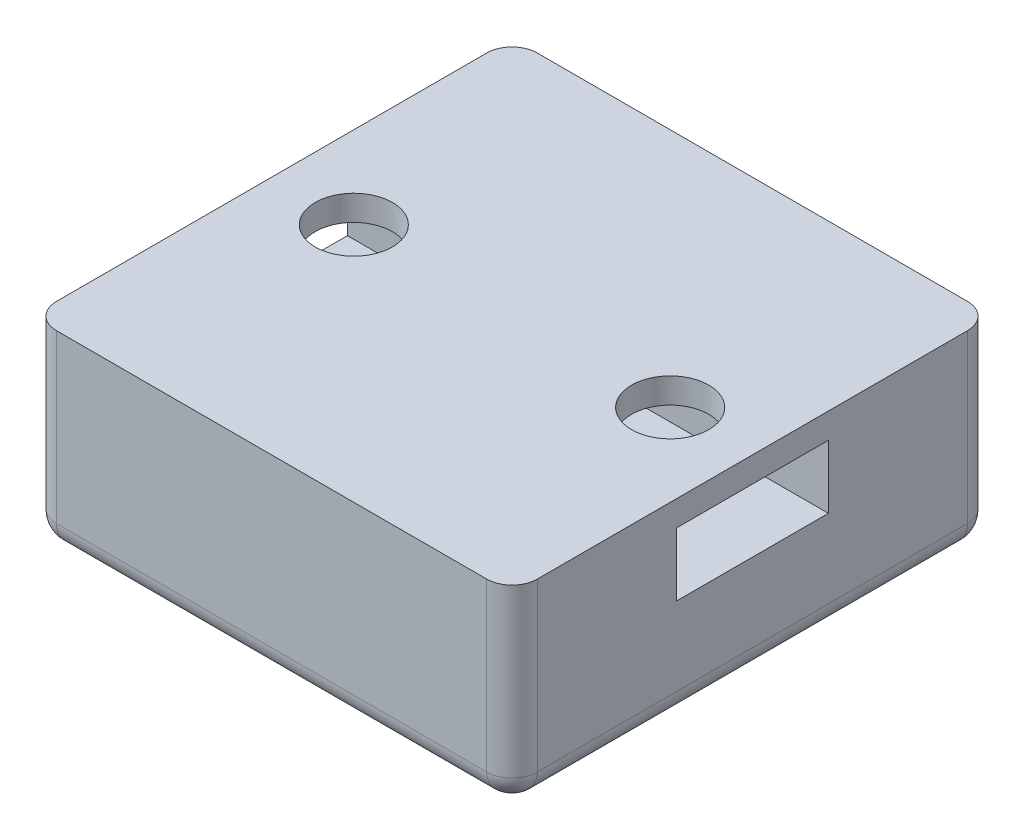
ISO-10303-21;
HEADER;
FILE_DESCRIPTION(('STEP AP214'),'2;1');
FILE_NAME('part.step','',(''),(''),'','','');
FILE_SCHEMA(('AUTOMOTIVE_DESIGN { 1 0 10303 214 1 1 1 1 }'));
ENDSEC;
DATA;
#1=APPLICATION_CONTEXT('core data for automotive mechanical design processes');
#2=APPLICATION_PROTOCOL_DEFINITION('international standard','automotive_design',2000,#1);
#3=PRODUCT_CONTEXT('',#1,'mechanical');
#4=PRODUCT('Part','Part','',(#3));
#5=PRODUCT_RELATED_PRODUCT_CATEGORY('part','',(#4));
#6=PRODUCT_DEFINITION_FORMATION('','',#4);
#7=PRODUCT_DEFINITION_CONTEXT('part definition',#1,'design');
#8=PRODUCT_DEFINITION('design','',#6,#7);
#9=PRODUCT_DEFINITION_SHAPE('','',#8);
#10=(LENGTH_UNIT() NAMED_UNIT(*) SI_UNIT(.MILLI.,.METRE.));
#11=(NAMED_UNIT(*) PLANE_ANGLE_UNIT() SI_UNIT($,.RADIAN.));
#12=(NAMED_UNIT(*) SI_UNIT($,.STERADIAN.) SOLID_ANGLE_UNIT());
#13=UNCERTAINTY_MEASURE_WITH_UNIT(LENGTH_MEASURE(1.E-05),#10,'distance_accuracy_value','');
#14=(GEOMETRIC_REPRESENTATION_CONTEXT(3) GLOBAL_UNCERTAINTY_ASSIGNED_CONTEXT((#13)) GLOBAL_UNIT_ASSIGNED_CONTEXT((#10,
#11,#12)) REPRESENTATION_CONTEXT('',''));
#15=CARTESIAN_POINT('',(0.,0.,0.));
#16=DIRECTION('',(0.,0.,1.));
#17=DIRECTION('',(1.,0.,0.));
#18=AXIS2_PLACEMENT_3D('',#15,#16,#17);
#19=CARTESIAN_POINT('',(0.,7.6,0.));
#20=DIRECTION('',(1.,0.,0.));
#21=DIRECTION('',(0.,0.,-1.));
#22=AXIS2_PLACEMENT_3D('',#19,#20,#21);
#23=PLANE('',#22);
#24=DIRECTION('',(0.,0.,-1.));
#25=VECTOR('',#24,1.);
#26=CARTESIAN_POINT('',(0.,6.6,-6.5));
#27=LINE('',#26,#25);
#28=CARTESIAN_POINT('',(0.,6.6,-6.5));
#29=VERTEX_POINT('',#28);
#30=CARTESIAN_POINT('',(0.,6.6,-12.5));
#31=VERTEX_POINT('',#30);
#32=EDGE_CURVE('E173',#29,#31,#27,.T.);
#33=ORIENTED_EDGE('',*,*,#32,.F.);
#34=DIRECTION('',(0.,1.,0.));
#35=VECTOR('',#34,1.);
#36=CARTESIAN_POINT('',(0.,6.6,-6.5));
#37=LINE('',#36,#35);
#38=CARTESIAN_POINT('',(0.,4.1,-6.5));
#39=VERTEX_POINT('',#38);
#40=EDGE_CURVE('E150',#39,#29,#37,.T.);
#41=ORIENTED_EDGE('',*,*,#40,.F.);
#42=DIRECTION('',(0.,0.,1.));
#43=VECTOR('',#42,1.);
#44=CARTESIAN_POINT('',(0.,4.1,-6.5));
#45=LINE('',#44,#43);
#46=CARTESIAN_POINT('',(0.,4.1,-12.5));
#47=VERTEX_POINT('',#46);
#48=EDGE_CURVE('E163',#47,#39,#45,.T.);
#49=ORIENTED_EDGE('',*,*,#48,.F.);
#50=DIRECTION('',(0.,-1.,0.));
#51=VECTOR('',#50,1.);
#52=CARTESIAN_POINT('',(0.,6.6,-12.5));
#53=LINE('',#52,#51);
#54=EDGE_CURVE('E180',#31,#47,#53,.T.);
#55=ORIENTED_EDGE('',*,*,#54,.F.);
#56=EDGE_LOOP('',(#33,#41,#49,#55));
#57=FACE_BOUND('',#56,.T.);
#58=DIRECTION('',(0.,-1.,0.));
#59=VECTOR('',#58,1.);
#60=CARTESIAN_POINT('',(0.,7.6,-18.));
#61=LINE('',#60,#59);
#62=CARTESIAN_POINT('',(0.,7.6,-18.));
#63=VERTEX_POINT('',#62);
#64=CARTESIAN_POINT('',(0.,1.,-18.));
#65=VERTEX_POINT('',#64);
#66=EDGE_CURVE('E218',#63,#65,#61,.T.);
#67=ORIENTED_EDGE('',*,*,#66,.T.);
#68=DIRECTION('',(0.,0.,1.));
#69=VECTOR('',#68,1.);
#70=CARTESIAN_POINT('',(0.,1.,-1.));
#71=LINE('',#70,#69);
#72=CARTESIAN_POINT('',(0.,1.,-1.));
#73=VERTEX_POINT('',#72);
#74=EDGE_CURVE('E50',#65,#73,#71,.T.);
#75=ORIENTED_EDGE('',*,*,#74,.T.);
#76=DIRECTION('',(0.,-1.,0.));
#77=VECTOR('',#76,1.);
#78=CARTESIAN_POINT('',(0.,7.6,-1.));
#79=LINE('',#78,#77);
#80=CARTESIAN_POINT('',(0.,7.6,-1.));
#81=VERTEX_POINT('',#80);
#82=EDGE_CURVE('E215',#73,#81,#79,.F.);
#83=ORIENTED_EDGE('',*,*,#82,.T.);
#84=DIRECTION('',(0.,0.,1.));
#85=VECTOR('',#84,1.);
#86=CARTESIAN_POINT('',(0.,7.6,0.));
#87=LINE('',#86,#85);
#88=EDGE_CURVE('E168',#63,#81,#87,.T.);
#89=ORIENTED_EDGE('',*,*,#88,.F.);
#90=EDGE_LOOP('',(#67,#75,#83,#89));
#91=FACE_BOUND('',#90,.T.);
#92=ADVANCED_FACE('F40',(#57,#91),#23,.F.);
#93=CARTESIAN_POINT('',(0.,7.6,0.));
#94=DIRECTION('',(0.,0.,-1.));
#95=DIRECTION('',(-1.,0.,0.));
#96=AXIS2_PLACEMENT_3D('',#93,#94,#95);
#97=PLANE('',#96);
#98=DIRECTION('',(0.,-1.,0.));
#99=VECTOR('',#98,1.);
#100=CARTESIAN_POINT('',(1.,7.6,0.));
#101=LINE('',#100,#99);
#102=CARTESIAN_POINT('',(1.,7.6,0.));
#103=VERTEX_POINT('',#102);
#104=CARTESIAN_POINT('',(1.,1.,0.));
#105=VERTEX_POINT('',#104);
#106=EDGE_CURVE('E249',#103,#105,#101,.T.);
#107=ORIENTED_EDGE('',*,*,#106,.T.);
#108=DIRECTION('',(1.,0.,0.));
#109=VECTOR('',#108,1.);
#110=CARTESIAN_POINT('',(18.,1.,0.));
#111=LINE('',#110,#109);
#112=CARTESIAN_POINT('',(18.,1.,0.));
#113=VERTEX_POINT('',#112);
#114=EDGE_CURVE('E257',#105,#113,#111,.T.);
#115=ORIENTED_EDGE('',*,*,#114,.T.);
#116=DIRECTION('',(0.,-1.,0.));
#117=VECTOR('',#116,1.);
#118=CARTESIAN_POINT('',(18.,7.6,0.));
#119=LINE('',#118,#117);
#120=CARTESIAN_POINT('',(18.,7.6,0.));
#121=VERTEX_POINT('',#120);
#122=EDGE_CURVE('E246',#113,#121,#119,.F.);
#123=ORIENTED_EDGE('',*,*,#122,.T.);
#124=DIRECTION('',(1.,0.,0.));
#125=VECTOR('',#124,1.);
#126=CARTESIAN_POINT('',(0.,7.6,0.));
#127=LINE('',#126,#125);
#128=EDGE_CURVE('E203',#103,#121,#127,.T.);
#129=ORIENTED_EDGE('',*,*,#128,.F.);
#130=EDGE_LOOP('',(#107,#115,#123,#129));
#131=FACE_BOUND('',#130,.T.);
#132=ADVANCED_FACE('F362',(#131),#97,.F.);
#133=CARTESIAN_POINT('',(19.,7.6,0.));
#134=DIRECTION('',(-1.,0.,0.));
#135=DIRECTION('',(0.,0.,1.));
#136=AXIS2_PLACEMENT_3D('',#133,#134,#135);
#137=PLANE('',#136);
#138=DIRECTION('',(0.,0.,-1.));
#139=VECTOR('',#138,1.);
#140=CARTESIAN_POINT('',(19.,4.1,-6.5));
#141=LINE('',#140,#139);
#142=CARTESIAN_POINT('',(19.,4.1,-6.5));
#143=VERTEX_POINT('',#142);
#144=CARTESIAN_POINT('',(19.,4.1,-12.5));
#145=VERTEX_POINT('',#144);
#146=EDGE_CURVE('E178',#143,#145,#141,.T.);
#147=ORIENTED_EDGE('',*,*,#146,.F.);
#148=DIRECTION('',(0.,-1.,0.));
#149=VECTOR('',#148,1.);
#150=CARTESIAN_POINT('',(19.,6.6,-6.5));
#151=LINE('',#150,#149);
#152=CARTESIAN_POINT('',(19.,6.6,-6.5));
#153=VERTEX_POINT('',#152);
#154=EDGE_CURVE('E153',#153,#143,#151,.T.);
#155=ORIENTED_EDGE('',*,*,#154,.F.);
#156=DIRECTION('',(0.,0.,1.));
#157=VECTOR('',#156,1.);
#158=CARTESIAN_POINT('',(19.,6.6,-6.5));
#159=LINE('',#158,#157);
#160=CARTESIAN_POINT('',(19.,6.6,-12.5));
#161=VERTEX_POINT('',#160);
#162=EDGE_CURVE('E159',#161,#153,#159,.T.);
#163=ORIENTED_EDGE('',*,*,#162,.F.);
#164=DIRECTION('',(0.,1.,0.));
#165=VECTOR('',#164,1.);
#166=CARTESIAN_POINT('',(19.,6.6,-12.5));
#167=LINE('',#166,#165);
#168=EDGE_CURVE('E186',#145,#161,#167,.T.);
#169=ORIENTED_EDGE('',*,*,#168,.F.);
#170=EDGE_LOOP('',(#147,#155,#163,#169));
#171=FACE_BOUND('',#170,.T.);
#172=DIRECTION('',(0.,-1.,0.));
#173=VECTOR('',#172,1.);
#174=CARTESIAN_POINT('',(19.,7.6,-1.));
#175=LINE('',#174,#173);
#176=CARTESIAN_POINT('',(19.,7.6,-1.));
#177=VERTEX_POINT('',#176);
#178=CARTESIAN_POINT('',(19.,1.,-1.));
#179=VERTEX_POINT('',#178);
#180=EDGE_CURVE('E239',#177,#179,#175,.T.);
#181=ORIENTED_EDGE('',*,*,#180,.T.);
#182=DIRECTION('',(0.,0.,-1.));
#183=VECTOR('',#182,1.);
#184=CARTESIAN_POINT('',(19.,1.,-18.));
#185=LINE('',#184,#183);
#186=CARTESIAN_POINT('',(19.,1.,-18.));
#187=VERTEX_POINT('',#186);
#188=EDGE_CURVE('E280',#179,#187,#185,.T.);
#189=ORIENTED_EDGE('',*,*,#188,.T.);
#190=DIRECTION('',(0.,-1.,0.));
#191=VECTOR('',#190,1.);
#192=CARTESIAN_POINT('',(19.,7.6,-18.));
#193=LINE('',#192,#191);
#194=CARTESIAN_POINT('',(19.,7.6,-18.));
#195=VERTEX_POINT('',#194);
#196=EDGE_CURVE('E243',#187,#195,#193,.F.);
#197=ORIENTED_EDGE('',*,*,#196,.T.);
#198=DIRECTION('',(0.,0.,-1.));
#199=VECTOR('',#198,1.);
#200=CARTESIAN_POINT('',(19.,7.6,0.));
#201=LINE('',#200,#199);
#202=EDGE_CURVE('E207',#177,#195,#201,.T.);
#203=ORIENTED_EDGE('',*,*,#202,.F.);
#204=EDGE_LOOP('',(#181,#189,#197,#203));
#205=FACE_BOUND('',#204,.T.);
#206=ADVANCED_FACE('F358',(#171,#205),#137,.F.);
#207=CARTESIAN_POINT('',(0.,7.6,-19.));
#208=DIRECTION('',(0.,0.,1.));
#209=DIRECTION('',(1.,0.,0.));
#210=AXIS2_PLACEMENT_3D('',#207,#208,#209);
#211=PLANE('',#210);
#212=DIRECTION('',(0.,-1.,0.));
#213=VECTOR('',#212,1.);
#214=CARTESIAN_POINT('',(18.,7.6,-19.));
#215=LINE('',#214,#213);
#216=CARTESIAN_POINT('',(18.,7.6,-19.));
#217=VERTEX_POINT('',#216);
#218=CARTESIAN_POINT('',(18.,1.,-19.));
#219=VERTEX_POINT('',#218);
#220=EDGE_CURVE('E221',#217,#219,#215,.T.);
#221=ORIENTED_EDGE('',*,*,#220,.T.);
#222=DIRECTION('',(-1.,0.,0.));
#223=VECTOR('',#222,1.);
#224=CARTESIAN_POINT('',(1.,1.,-19.));
#225=LINE('',#224,#223);
#226=CARTESIAN_POINT('',(1.,1.,-19.));
#227=VERTEX_POINT('',#226);
#228=EDGE_CURVE('E66',#219,#227,#225,.T.);
#229=ORIENTED_EDGE('',*,*,#228,.T.);
#230=DIRECTION('',(0.,-1.,0.));
#231=VECTOR('',#230,1.);
#232=CARTESIAN_POINT('',(1.,7.6,-19.));
#233=LINE('',#232,#231);
#234=CARTESIAN_POINT('',(1.,7.6,-19.));
#235=VERTEX_POINT('',#234);
#236=EDGE_CURVE('E224',#227,#235,#233,.F.);
#237=ORIENTED_EDGE('',*,*,#236,.T.);
#238=DIRECTION('',(-1.,0.,0.));
#239=VECTOR('',#238,1.);
#240=CARTESIAN_POINT('',(0.,7.6,-19.));
#241=LINE('',#240,#239);
#242=EDGE_CURVE('E211',#217,#235,#241,.T.);
#243=ORIENTED_EDGE('',*,*,#242,.F.);
#244=EDGE_LOOP('',(#221,#229,#237,#243));
#245=FACE_BOUND('',#244,.T.);
#246=ADVANCED_FACE('F361',(#245),#211,.F.);
#247=CARTESIAN_POINT('',(0.,7.6,0.));
#248=DIRECTION('',(0.,-1.,0.));
#249=DIRECTION('',(0.,0.,-1.));
#250=AXIS2_PLACEMENT_3D('',#247,#248,#249);
#251=PLANE('',#250);
#252=CARTESIAN_POINT('',(3.25,7.6,-9.5));
#253=DIRECTION('',(0.,1.,0.));
#254=DIRECTION('',(0.,0.,1.));
#255=AXIS2_PLACEMENT_3D('',#252,#253,#254);
#256=CIRCLE('',#255,1.525);
#257=CARTESIAN_POINT('',(3.25,7.6,-7.975));
#258=VERTEX_POINT('',#257);
#259=EDGE_CURVE('E340',#258,#258,#256,.T.);
#260=ORIENTED_EDGE('',*,*,#259,.F.);
#261=EDGE_LOOP('',(#260));
#262=FACE_BOUND('',#261,.T.);
#263=CARTESIAN_POINT('',(15.75,7.6,-9.5));
#264=DIRECTION('',(0.,1.,0.));
#265=DIRECTION('',(0.,0.,-1.));
#266=AXIS2_PLACEMENT_3D('',#263,#264,#265);
#267=CIRCLE('',#266,1.525);
#268=CARTESIAN_POINT('',(15.75,7.6,-7.975));
#269=VERTEX_POINT('',#268);
#270=EDGE_CURVE('E329',#269,#269,#267,.T.);
#271=ORIENTED_EDGE('',*,*,#270,.F.);
#272=EDGE_LOOP('',(#271));
#273=FACE_BOUND('',#272,.T.);
#274=ORIENTED_EDGE('',*,*,#242,.T.);
#275=CARTESIAN_POINT('',(1.,7.6,-18.));
#276=DIRECTION('',(0.,-1.,0.));
#277=DIRECTION('',(0.,0.,-1.));
#278=AXIS2_PLACEMENT_3D('',#275,#276,#277);
#279=CIRCLE('',#278,1.);
#280=EDGE_CURVE('E236',#235,#63,#279,.F.);
#281=ORIENTED_EDGE('',*,*,#280,.T.);
#282=ORIENTED_EDGE('',*,*,#88,.T.);
#283=CARTESIAN_POINT('',(1.,7.6,-1.));
#284=DIRECTION('',(0.,-1.,0.));
#285=DIRECTION('',(0.,0.,-1.));
#286=AXIS2_PLACEMENT_3D('',#283,#284,#285);
#287=CIRCLE('',#286,1.);
#288=EDGE_CURVE('E230',#81,#103,#287,.F.);
#289=ORIENTED_EDGE('',*,*,#288,.T.);
#290=ORIENTED_EDGE('',*,*,#128,.T.);
#291=CARTESIAN_POINT('',(18.,7.6,-1.));
#292=DIRECTION('',(0.,-1.,0.));
#293=DIRECTION('',(0.,0.,-1.));
#294=AXIS2_PLACEMENT_3D('',#291,#292,#293);
#295=CIRCLE('',#294,1.);
#296=EDGE_CURVE('E227',#121,#177,#295,.F.);
#297=ORIENTED_EDGE('',*,*,#296,.T.);
#298=ORIENTED_EDGE('',*,*,#202,.T.);
#299=CARTESIAN_POINT('',(18.,7.6,-18.));
#300=DIRECTION('',(0.,-1.,0.));
#301=DIRECTION('',(0.,0.,-1.));
#302=AXIS2_PLACEMENT_3D('',#299,#300,#301);
#303=CIRCLE('',#302,1.);
#304=EDGE_CURVE('E233',#195,#217,#303,.F.);
#305=ORIENTED_EDGE('',*,*,#304,.T.);
#306=EDGE_LOOP('',(#274,#281,#282,#289,#290,#297,#298,#305));
#307=FACE_BOUND('',#306,.T.);
#308=ADVANCED_FACE('F407',(#262,#273,#307),#251,.F.);
#309=CARTESIAN_POINT('',(0.,0.,0.));
#310=DIRECTION('',(0.,-1.,0.));
#311=DIRECTION('',(0.,0.,-1.));
#312=AXIS2_PLACEMENT_3D('',#309,#310,#311);
#313=PLANE('',#312);
#314=DIRECTION('',(0.,0.,-1.));
#315=VECTOR('',#314,1.);
#316=CARTESIAN_POINT('',(18.,0.,-1.));
#317=LINE('',#316,#315);
#318=CARTESIAN_POINT('',(18.,0.,-18.));
#319=VERTEX_POINT('',#318);
#320=CARTESIAN_POINT('',(18.,0.,-1.));
#321=VERTEX_POINT('',#320);
#322=EDGE_CURVE('E270',#319,#321,#317,.F.);
#323=ORIENTED_EDGE('',*,*,#322,.T.);
#324=DIRECTION('',(1.,0.,0.));
#325=VECTOR('',#324,1.);
#326=CARTESIAN_POINT('',(1.,0.,-1.));
#327=LINE('',#326,#325);
#328=CARTESIAN_POINT('',(1.,0.,-1.));
#329=VERTEX_POINT('',#328);
#330=EDGE_CURVE('E273',#321,#329,#327,.F.);
#331=ORIENTED_EDGE('',*,*,#330,.T.);
#332=DIRECTION('',(0.,0.,1.));
#333=VECTOR('',#332,1.);
#334=CARTESIAN_POINT('',(1.,0.,-18.));
#335=LINE('',#334,#333);
#336=CARTESIAN_POINT('',(1.,0.,-18.));
#337=VERTEX_POINT('',#336);
#338=EDGE_CURVE('E264',#329,#337,#335,.F.);
#339=ORIENTED_EDGE('',*,*,#338,.T.);
#340=DIRECTION('',(-1.,0.,0.));
#341=VECTOR('',#340,1.);
#342=CARTESIAN_POINT('',(18.,0.,-18.));
#343=LINE('',#342,#341);
#344=EDGE_CURVE('E267',#337,#319,#343,.F.);
#345=ORIENTED_EDGE('',*,*,#344,.T.);
#346=EDGE_LOOP('',(#323,#331,#339,#345));
#347=FACE_BOUND('',#346,.T.);
#348=CARTESIAN_POINT('',(9.49999999999999,0.,-9.5));
#349=DIRECTION('',(0.,-1.,0.));
#350=DIRECTION('',(0.,0.,-1.));
#351=AXIS2_PLACEMENT_3D('',#348,#349,#350);
#352=CIRCLE('',#351,6.05);
#353=CARTESIAN_POINT('',(9.49999999999999,0.,-15.55));
#354=VERTEX_POINT('',#353);
#355=EDGE_CURVE('E260',#354,#354,#352,.F.);
#356=ORIENTED_EDGE('',*,*,#355,.T.);
#357=EDGE_LOOP('',(#356));
#358=FACE_BOUND('',#357,.T.);
#359=ADVANCED_FACE('F382',(#347,#358),#313,.T.);
#360=CARTESIAN_POINT('',(-0.001000000000001,6.6,-6.5));
#361=DIRECTION('',(0.,0.,1.));
#362=DIRECTION('',(1.,0.,0.));
#363=AXIS2_PLACEMENT_3D('',#360,#361,#362);
#364=PLANE('',#363);
#365=ORIENTED_EDGE('',*,*,#40,.T.);
#366=DIRECTION('',(1.,0.,0.));
#367=VECTOR('',#366,1.);
#368=CARTESIAN_POINT('',(-0.001000000000001,6.6,-6.5));
#369=LINE('',#368,#367);
#370=EDGE_CURVE('E169',#29,#153,#369,.T.);
#371=ORIENTED_EDGE('',*,*,#370,.T.);
#372=ORIENTED_EDGE('',*,*,#154,.T.);
#373=DIRECTION('',(1.,0.,0.));
#374=VECTOR('',#373,1.);
#375=CARTESIAN_POINT('',(-0.001000000000001,4.1,-6.5));
#376=LINE('',#375,#374);
#377=EDGE_CURVE('E146',#39,#143,#376,.T.);
#378=ORIENTED_EDGE('',*,*,#377,.F.);
#379=EDGE_LOOP('',(#365,#371,#372,#378));
#380=FACE_BOUND('',#379,.T.);
#381=ADVANCED_FACE('F148',(#380),#364,.F.);
#382=CARTESIAN_POINT('',(-0.001000000000001,6.6,-6.5));
#383=DIRECTION('',(0.,1.,0.));
#384=DIRECTION('',(0.,0.,1.));
#385=AXIS2_PLACEMENT_3D('',#382,#383,#384);
#386=PLANE('',#385);
#387=CARTESIAN_POINT('',(3.25,6.6,-9.5));
#388=DIRECTION('',(0.,1.,0.));
#389=DIRECTION('',(0.,0.,1.));
#390=AXIS2_PLACEMENT_3D('',#387,#388,#389);
#391=CIRCLE('',#390,1.525);
#392=CARTESIAN_POINT('',(3.25,6.6,-7.975));
#393=VERTEX_POINT('',#392);
#394=EDGE_CURVE('E344',#393,#393,#391,.F.);
#395=ORIENTED_EDGE('',*,*,#394,.F.);
#396=EDGE_LOOP('',(#395));
#397=FACE_BOUND('',#396,.T.);
#398=CARTESIAN_POINT('',(15.75,6.6,-9.5));
#399=DIRECTION('',(0.,1.,0.));
#400=DIRECTION('',(0.,0.,1.));
#401=AXIS2_PLACEMENT_3D('',#398,#399,#400);
#402=CIRCLE('',#401,1.525);
#403=CARTESIAN_POINT('',(15.75,6.6,-7.975));
#404=VERTEX_POINT('',#403);
#405=EDGE_CURVE('E335',#404,#404,#402,.F.);
#406=ORIENTED_EDGE('',*,*,#405,.F.);
#407=EDGE_LOOP('',(#406));
#408=FACE_BOUND('',#407,.T.);
#409=ORIENTED_EDGE('',*,*,#32,.T.);
#410=DIRECTION('',(1.,0.,0.));
#411=VECTOR('',#410,1.);
#412=CARTESIAN_POINT('',(-0.00100000000000447,6.6,-12.5));
#413=LINE('',#412,#411);
#414=EDGE_CURVE('E195',#31,#161,#413,.T.);
#415=ORIENTED_EDGE('',*,*,#414,.T.);
#416=ORIENTED_EDGE('',*,*,#162,.T.);
#417=ORIENTED_EDGE('',*,*,#370,.F.);
#418=EDGE_LOOP('',(#409,#415,#416,#417));
#419=FACE_BOUND('',#418,.T.);
#420=ADVANCED_FACE('F356',(#397,#408,#419),#386,.F.);
#421=CARTESIAN_POINT('',(-0.00100000000000447,6.6,-12.5));
#422=DIRECTION('',(0.,0.,-1.));
#423=DIRECTION('',(-1.,0.,0.));
#424=AXIS2_PLACEMENT_3D('',#421,#422,#423);
#425=PLANE('',#424);
#426=ORIENTED_EDGE('',*,*,#54,.T.);
#427=DIRECTION('',(1.,0.,0.));
#428=VECTOR('',#427,1.);
#429=CARTESIAN_POINT('',(-0.00100000000000447,4.1,-12.5));
#430=LINE('',#429,#428);
#431=EDGE_CURVE('E158',#47,#145,#430,.T.);
#432=ORIENTED_EDGE('',*,*,#431,.T.);
#433=ORIENTED_EDGE('',*,*,#168,.T.);
#434=ORIENTED_EDGE('',*,*,#414,.F.);
#435=EDGE_LOOP('',(#426,#432,#433,#434));
#436=FACE_BOUND('',#435,.T.);
#437=ADVANCED_FACE('F352',(#436),#425,.F.);
#438=CARTESIAN_POINT('',(-0.001000000000001,4.1,-6.5));
#439=DIRECTION('',(0.,-1.,0.));
#440=DIRECTION('',(0.,0.,-1.));
#441=AXIS2_PLACEMENT_3D('',#438,#439,#440);
#442=PLANE('',#441);
#443=CARTESIAN_POINT('',(9.49999999999999,4.1,-9.5));
#444=DIRECTION('',(0.,-1.,0.));
#445=DIRECTION('',(0.,0.,-1.));
#446=AXIS2_PLACEMENT_3D('',#443,#444,#445);
#447=CIRCLE('',#446,1.55);
#448=CARTESIAN_POINT('',(9.49999999999999,4.1,-11.05));
#449=VERTEX_POINT('',#448);
#450=EDGE_CURVE('E673',#449,#449,#447,.F.);
#451=ORIENTED_EDGE('',*,*,#450,.F.);
#452=EDGE_LOOP('',(#451));
#453=FACE_BOUND('',#452,.T.);
#454=ORIENTED_EDGE('',*,*,#48,.T.);
#455=ORIENTED_EDGE('',*,*,#377,.T.);
#456=ORIENTED_EDGE('',*,*,#146,.T.);
#457=ORIENTED_EDGE('',*,*,#431,.F.);
#458=EDGE_LOOP('',(#454,#455,#456,#457));
#459=FACE_BOUND('',#458,.T.);
#460=ADVANCED_FACE('F164',(#453,#459),#442,.F.);
#461=CARTESIAN_POINT('',(15.75,-0.00100000000000013,-9.5));
#462=DIRECTION('',(0.,1.,0.));
#463=DIRECTION('',(0.,0.,1.));
#464=AXIS2_PLACEMENT_3D('',#461,#462,#463);
#465=CYLINDRICAL_SURFACE('',#464,1.525);
#466=CARTESIAN_POINT('',(15.75,7.6,-7.975));
#467=CARTESIAN_POINT('',(15.75,7.58958333333333,-7.975));
#468=CARTESIAN_POINT('',(15.75,7.57916666666667,-7.975));
#469=CARTESIAN_POINT('',(15.75,7.55833333333333,-7.975));
#470=CARTESIAN_POINT('',(15.75,7.54791666666667,-7.975));
#471=CARTESIAN_POINT('',(15.75,7.52708333333333,-7.975));
#472=CARTESIAN_POINT('',(15.75,7.51666666666667,-7.975));
#473=CARTESIAN_POINT('',(15.75,7.49583333333333,-7.975));
#474=CARTESIAN_POINT('',(15.75,7.48541666666667,-7.975));
#475=CARTESIAN_POINT('',(15.75,7.46458333333333,-7.975));
#476=CARTESIAN_POINT('',(15.75,7.45416666666667,-7.975));
#477=CARTESIAN_POINT('',(15.75,7.43333333333333,-7.975));
#478=CARTESIAN_POINT('',(15.75,7.42291666666667,-7.975));
#479=CARTESIAN_POINT('',(15.75,7.40208333333333,-7.975));
#480=CARTESIAN_POINT('',(15.75,7.39166666666667,-7.975));
#481=CARTESIAN_POINT('',(15.75,7.37083333333333,-7.975));
#482=CARTESIAN_POINT('',(15.75,7.36041666666667,-7.975));
#483=CARTESIAN_POINT('',(15.75,7.33958333333333,-7.975));
#484=CARTESIAN_POINT('',(15.75,7.32916666666667,-7.975));
#485=CARTESIAN_POINT('',(15.75,7.30833333333333,-7.975));
#486=CARTESIAN_POINT('',(15.75,7.29791666666667,-7.975));
#487=CARTESIAN_POINT('',(15.75,7.27708333333333,-7.975));
#488=CARTESIAN_POINT('',(15.75,7.26666666666667,-7.975));
#489=CARTESIAN_POINT('',(15.75,7.24583333333333,-7.975));
#490=CARTESIAN_POINT('',(15.75,7.23541666666667,-7.975));
#491=CARTESIAN_POINT('',(15.75,7.21458333333333,-7.975));
#492=CARTESIAN_POINT('',(15.75,7.20416666666667,-7.975));
#493=CARTESIAN_POINT('',(15.75,7.18333333333333,-7.975));
#494=CARTESIAN_POINT('',(15.75,7.17291666666667,-7.975));
#495=CARTESIAN_POINT('',(15.75,7.15208333333333,-7.975));
#496=CARTESIAN_POINT('',(15.75,7.14166666666667,-7.975));
#497=CARTESIAN_POINT('',(15.75,7.12083333333333,-7.975));
#498=CARTESIAN_POINT('',(15.75,7.11041666666667,-7.975));
#499=CARTESIAN_POINT('',(15.75,7.08958333333333,-7.975));
#500=CARTESIAN_POINT('',(15.75,7.07916666666667,-7.975));
#501=CARTESIAN_POINT('',(15.75,7.05833333333333,-7.975));
#502=CARTESIAN_POINT('',(15.75,7.04791666666667,-7.975));
#503=CARTESIAN_POINT('',(15.75,7.02708333333333,-7.975));
#504=CARTESIAN_POINT('',(15.75,7.01666666666667,-7.975));
#505=CARTESIAN_POINT('',(15.75,6.99583333333333,-7.975));
#506=CARTESIAN_POINT('',(15.75,6.98541666666667,-7.975));
#507=CARTESIAN_POINT('',(15.75,6.96458333333333,-7.975));
#508=CARTESIAN_POINT('',(15.75,6.95416666666667,-7.975));
#509=CARTESIAN_POINT('',(15.75,6.93333333333333,-7.975));
#510=CARTESIAN_POINT('',(15.75,6.92291666666667,-7.975));
#511=CARTESIAN_POINT('',(15.75,6.90208333333333,-7.975));
#512=CARTESIAN_POINT('',(15.75,6.89166666666667,-7.975));
#513=CARTESIAN_POINT('',(15.75,6.87083333333333,-7.975));
#514=CARTESIAN_POINT('',(15.75,6.86041666666667,-7.975));
#515=CARTESIAN_POINT('',(15.75,6.83958333333333,-7.975));
#516=CARTESIAN_POINT('',(15.75,6.82916666666667,-7.975));
#517=CARTESIAN_POINT('',(15.75,6.80833333333333,-7.975));
#518=CARTESIAN_POINT('',(15.75,6.79791666666667,-7.975));
#519=CARTESIAN_POINT('',(15.75,6.77708333333333,-7.975));
#520=CARTESIAN_POINT('',(15.75,6.76666666666667,-7.975));
#521=CARTESIAN_POINT('',(15.75,6.74583333333333,-7.975));
#522=CARTESIAN_POINT('',(15.75,6.73541666666667,-7.975));
#523=CARTESIAN_POINT('',(15.75,6.71458333333333,-7.975));
#524=CARTESIAN_POINT('',(15.75,6.70416666666667,-7.975));
#525=CARTESIAN_POINT('',(15.75,6.68333333333333,-7.975));
#526=CARTESIAN_POINT('',(15.75,6.67291666666667,-7.975));
#527=CARTESIAN_POINT('',(15.75,6.65208333333333,-7.975));
#528=CARTESIAN_POINT('',(15.75,6.64166666666667,-7.975));
#529=CARTESIAN_POINT('',(15.75,6.62083333333333,-7.975));
#530=CARTESIAN_POINT('',(15.75,6.61041666666667,-7.975));
#531=CARTESIAN_POINT('',(15.75,6.6,-7.975));
#532=B_SPLINE_CURVE_WITH_KNOTS('',3,(#466,#467,#468,#469,#470,#471,#472,#473,#474,#475,#476,
#477,#478,#479,#480,#481,#482,#483,#484,#485,#486,#487,#488,#489,#490,#491,#492,#493,#494,#495,
#496,#497,#498,#499,#500,#501,#502,#503,#504,#505,#506,#507,#508,#509,#510,#511,#512,#513,#514,
#515,#516,#517,#518,#519,#520,#521,#522,#523,#524,#525,#526,#527,#528,#529,#530,#531),
.UNSPECIFIED.,.F.,.F.,(4,2,2,2,2,2,2,2,2,2,2,2,2,2,2,2,2,2,2,2,2,2,2,2,2,2,2,2,2,2,2,2,4),(0.,
0.03125,0.0625000000000001,0.0937500000000001,0.125,0.15625,0.1875,0.21875,0.25,
0.281249999999999,0.312499999999999,0.343749999999999,0.374999999999999,0.40625,0.4375,0.46875,
0.5,0.53125,0.5625,0.59375,0.625,0.65625,0.6875,0.718749999999999,0.749999999999999,
0.781249999999999,0.812499999999999,0.843749999999999,0.874999999999999,0.906249999999999,
0.937499999999999,0.968749999999999,0.999999999999999),.UNSPECIFIED.);
#533=EDGE_CURVE('BSEAM509',#269,#404,#532,.T.);
#534=ORIENTED_EDGE('',*,*,#270,.T.);
#535=ORIENTED_EDGE('',*,*,#405,.T.);
#536=ORIENTED_EDGE('',*,*,#533,.T.);
#537=ORIENTED_EDGE('',*,*,#533,.F.);
#538=EDGE_LOOP('',(#534,#536,#535,#537));
#539=FACE_BOUND('',#538,.T.);
#540=ADVANCED_FACE('F509',(#539),#465,.F.);
#541=CARTESIAN_POINT('',(3.25,-0.00100000000000013,-9.5));
#542=DIRECTION('',(0.,1.,0.));
#543=DIRECTION('',(0.,0.,1.));
#544=AXIS2_PLACEMENT_3D('',#541,#542,#543);
#545=CYLINDRICAL_SURFACE('',#544,1.525);
#546=CARTESIAN_POINT('',(3.25,7.6,-7.975));
#547=CARTESIAN_POINT('',(3.25,7.58958333333333,-7.975));
#548=CARTESIAN_POINT('',(3.25,7.57916666666667,-7.975));
#549=CARTESIAN_POINT('',(3.25,7.55833333333333,-7.975));
#550=CARTESIAN_POINT('',(3.25,7.54791666666667,-7.975));
#551=CARTESIAN_POINT('',(3.25,7.52708333333333,-7.975));
#552=CARTESIAN_POINT('',(3.25,7.51666666666667,-7.975));
#553=CARTESIAN_POINT('',(3.25,7.49583333333333,-7.975));
#554=CARTESIAN_POINT('',(3.25,7.48541666666667,-7.975));
#555=CARTESIAN_POINT('',(3.25,7.46458333333333,-7.975));
#556=CARTESIAN_POINT('',(3.25,7.45416666666667,-7.975));
#557=CARTESIAN_POINT('',(3.25,7.43333333333333,-7.975));
#558=CARTESIAN_POINT('',(3.25,7.42291666666667,-7.975));
#559=CARTESIAN_POINT('',(3.25,7.40208333333333,-7.975));
#560=CARTESIAN_POINT('',(3.25,7.39166666666667,-7.975));
#561=CARTESIAN_POINT('',(3.25,7.37083333333333,-7.975));
#562=CARTESIAN_POINT('',(3.25,7.36041666666667,-7.975));
#563=CARTESIAN_POINT('',(3.25,7.33958333333333,-7.975));
#564=CARTESIAN_POINT('',(3.25,7.32916666666667,-7.975));
#565=CARTESIAN_POINT('',(3.25,7.30833333333333,-7.975));
#566=CARTESIAN_POINT('',(3.25,7.29791666666667,-7.975));
#567=CARTESIAN_POINT('',(3.25,7.27708333333333,-7.975));
#568=CARTESIAN_POINT('',(3.25,7.26666666666667,-7.975));
#569=CARTESIAN_POINT('',(3.25,7.24583333333333,-7.975));
#570=CARTESIAN_POINT('',(3.25,7.23541666666667,-7.975));
#571=CARTESIAN_POINT('',(3.25,7.21458333333333,-7.975));
#572=CARTESIAN_POINT('',(3.25,7.20416666666667,-7.975));
#573=CARTESIAN_POINT('',(3.25,7.18333333333333,-7.975));
#574=CARTESIAN_POINT('',(3.25,7.17291666666667,-7.975));
#575=CARTESIAN_POINT('',(3.25,7.15208333333333,-7.975));
#576=CARTESIAN_POINT('',(3.25,7.14166666666667,-7.975));
#577=CARTESIAN_POINT('',(3.25,7.12083333333333,-7.975));
#578=CARTESIAN_POINT('',(3.25,7.11041666666667,-7.975));
#579=CARTESIAN_POINT('',(3.25,7.08958333333333,-7.975));
#580=CARTESIAN_POINT('',(3.25,7.07916666666667,-7.975));
#581=CARTESIAN_POINT('',(3.25,7.05833333333333,-7.975));
#582=CARTESIAN_POINT('',(3.25,7.04791666666667,-7.975));
#583=CARTESIAN_POINT('',(3.25,7.02708333333333,-7.975));
#584=CARTESIAN_POINT('',(3.25,7.01666666666667,-7.975));
#585=CARTESIAN_POINT('',(3.25,6.99583333333333,-7.975));
#586=CARTESIAN_POINT('',(3.25,6.98541666666667,-7.975));
#587=CARTESIAN_POINT('',(3.25,6.96458333333333,-7.975));
#588=CARTESIAN_POINT('',(3.25,6.95416666666667,-7.975));
#589=CARTESIAN_POINT('',(3.25,6.93333333333333,-7.975));
#590=CARTESIAN_POINT('',(3.25,6.92291666666667,-7.975));
#591=CARTESIAN_POINT('',(3.25,6.90208333333333,-7.975));
#592=CARTESIAN_POINT('',(3.25,6.89166666666667,-7.975));
#593=CARTESIAN_POINT('',(3.25,6.87083333333333,-7.975));
#594=CARTESIAN_POINT('',(3.25,6.86041666666667,-7.975));
#595=CARTESIAN_POINT('',(3.25,6.83958333333333,-7.975));
#596=CARTESIAN_POINT('',(3.25,6.82916666666667,-7.975));
#597=CARTESIAN_POINT('',(3.25,6.80833333333333,-7.975));
#598=CARTESIAN_POINT('',(3.25,6.79791666666667,-7.975));
#599=CARTESIAN_POINT('',(3.25,6.77708333333333,-7.975));
#600=CARTESIAN_POINT('',(3.25,6.76666666666667,-7.975));
#601=CARTESIAN_POINT('',(3.25,6.74583333333333,-7.975));
#602=CARTESIAN_POINT('',(3.25,6.73541666666667,-7.975));
#603=CARTESIAN_POINT('',(3.25,6.71458333333333,-7.975));
#604=CARTESIAN_POINT('',(3.25,6.70416666666667,-7.975));
#605=CARTESIAN_POINT('',(3.25,6.68333333333333,-7.975));
#606=CARTESIAN_POINT('',(3.25,6.67291666666667,-7.975));
#607=CARTESIAN_POINT('',(3.25,6.65208333333333,-7.975));
#608=CARTESIAN_POINT('',(3.25,6.64166666666667,-7.975));
#609=CARTESIAN_POINT('',(3.25,6.62083333333333,-7.975));
#610=CARTESIAN_POINT('',(3.25,6.61041666666667,-7.975));
#611=CARTESIAN_POINT('',(3.25,6.6,-7.975));
#612=B_SPLINE_CURVE_WITH_KNOTS('',3,(#546,#547,#548,#549,#550,#551,#552,#553,#554,#555,#556,
#557,#558,#559,#560,#561,#562,#563,#564,#565,#566,#567,#568,#569,#570,#571,#572,#573,#574,#575,
#576,#577,#578,#579,#580,#581,#582,#583,#584,#585,#586,#587,#588,#589,#590,#591,#592,#593,#594,
#595,#596,#597,#598,#599,#600,#601,#602,#603,#604,#605,#606,#607,#608,#609,#610,#611),
.UNSPECIFIED.,.F.,.F.,(4,2,2,2,2,2,2,2,2,2,2,2,2,2,2,2,2,2,2,2,2,2,2,2,2,2,2,2,2,2,2,2,4),(0.,
0.03125,0.0625000000000001,0.0937500000000001,0.125,0.15625,0.1875,0.21875,0.25,
0.281249999999999,0.312499999999999,0.343749999999999,0.374999999999999,0.40625,0.4375,0.46875,
0.5,0.53125,0.5625,0.59375,0.625,0.65625,0.6875,0.718749999999999,0.749999999999999,
0.781249999999999,0.812499999999999,0.843749999999999,0.874999999999999,0.906249999999999,
0.937499999999999,0.968749999999999,0.999999999999999),.UNSPECIFIED.);
#613=EDGE_CURVE('BSEAM525',#258,#393,#612,.T.);
#614=ORIENTED_EDGE('',*,*,#259,.T.);
#615=ORIENTED_EDGE('',*,*,#394,.T.);
#616=ORIENTED_EDGE('',*,*,#613,.T.);
#617=ORIENTED_EDGE('',*,*,#613,.F.);
#618=EDGE_LOOP('',(#614,#616,#615,#617));
#619=FACE_BOUND('',#618,.T.);
#620=ADVANCED_FACE('F525',(#619),#545,.F.);
#621=CARTESIAN_POINT('',(9.49999999999999,3.1,-9.5));
#622=DIRECTION('',(0.,-1.,0.));
#623=DIRECTION('',(0.,0.,-1.));
#624=AXIS2_PLACEMENT_3D('',#621,#622,#623);
#625=CYLINDRICAL_SURFACE('',#624,5.05);
#626=CARTESIAN_POINT('',(9.49999999999999,1.,-9.5));
#627=DIRECTION('',(0.,-1.,0.));
#628=DIRECTION('',(0.,0.,-1.));
#629=AXIS2_PLACEMENT_3D('',#626,#627,#628);
#630=CIRCLE('',#629,5.05);
#631=CARTESIAN_POINT('',(9.49999999999999,1.,-14.55));
#632=VERTEX_POINT('',#631);
#633=EDGE_CURVE('E11',#632,#632,#630,.T.);
#634=CARTESIAN_POINT('',(9.49999999999999,3.1,-9.5));
#635=DIRECTION('',(0.,-1.,0.));
#636=DIRECTION('',(0.,0.,-1.));
#637=AXIS2_PLACEMENT_3D('',#634,#635,#636);
#638=CIRCLE('',#637,5.05);
#639=CARTESIAN_POINT('',(9.49999999999999,3.1,-14.55));
#640=VERTEX_POINT('',#639);
#641=EDGE_CURVE('E323',#640,#640,#638,.T.);
#642=CARTESIAN_POINT('',(9.49999999999999,1.,-14.55));
#643=CARTESIAN_POINT('',(9.49999999999999,1.021875,-14.55));
#644=CARTESIAN_POINT('',(9.49999999999999,1.04375,-14.55));
#645=CARTESIAN_POINT('',(9.49999999999999,1.0875,-14.55));
#646=CARTESIAN_POINT('',(9.49999999999999,1.109375,-14.55));
#647=CARTESIAN_POINT('',(9.49999999999999,1.153125,-14.55));
#648=CARTESIAN_POINT('',(9.49999999999999,1.175,-14.55));
#649=CARTESIAN_POINT('',(9.49999999999999,1.21875,-14.55));
#650=CARTESIAN_POINT('',(9.49999999999999,1.240625,-14.55));
#651=CARTESIAN_POINT('',(9.49999999999999,1.284375,-14.55));
#652=CARTESIAN_POINT('',(9.49999999999999,1.30625,-14.55));
#653=CARTESIAN_POINT('',(9.49999999999999,1.35,-14.55));
#654=CARTESIAN_POINT('',(9.49999999999999,1.371875,-14.55));
#655=CARTESIAN_POINT('',(9.49999999999999,1.415625,-14.55));
#656=CARTESIAN_POINT('',(9.49999999999999,1.4375,-14.55));
#657=CARTESIAN_POINT('',(9.49999999999999,1.48125,-14.55));
#658=CARTESIAN_POINT('',(9.49999999999999,1.503125,-14.55));
#659=CARTESIAN_POINT('',(9.49999999999999,1.546875,-14.55));
#660=CARTESIAN_POINT('',(9.49999999999999,1.56875,-14.55));
#661=CARTESIAN_POINT('',(9.49999999999999,1.6125,-14.55));
#662=CARTESIAN_POINT('',(9.49999999999999,1.634375,-14.55));
#663=CARTESIAN_POINT('',(9.49999999999999,1.678125,-14.55));
#664=CARTESIAN_POINT('',(9.49999999999999,1.7,-14.55));
#665=CARTESIAN_POINT('',(9.49999999999999,1.74375,-14.55));
#666=CARTESIAN_POINT('',(9.49999999999999,1.765625,-14.55));
#667=CARTESIAN_POINT('',(9.49999999999999,1.809375,-14.55));
#668=CARTESIAN_POINT('',(9.49999999999999,1.83125,-14.55));
#669=CARTESIAN_POINT('',(9.49999999999999,1.875,-14.55));
#670=CARTESIAN_POINT('',(9.49999999999999,1.896875,-14.55));
#671=CARTESIAN_POINT('',(9.49999999999999,1.940625,-14.55));
#672=CARTESIAN_POINT('',(9.49999999999999,1.9625,-14.55));
#673=CARTESIAN_POINT('',(9.49999999999999,2.00625,-14.55));
#674=CARTESIAN_POINT('',(9.49999999999999,2.028125,-14.55));
#675=CARTESIAN_POINT('',(9.49999999999999,2.071875,-14.55));
#676=CARTESIAN_POINT('',(9.49999999999999,2.09375,-14.55));
#677=CARTESIAN_POINT('',(9.49999999999999,2.1375,-14.55));
#678=CARTESIAN_POINT('',(9.49999999999999,2.159375,-14.55));
#679=CARTESIAN_POINT('',(9.49999999999999,2.203125,-14.55));
#680=CARTESIAN_POINT('',(9.49999999999999,2.225,-14.55));
#681=CARTESIAN_POINT('',(9.49999999999999,2.26875,-14.55));
#682=CARTESIAN_POINT('',(9.49999999999999,2.290625,-14.55));
#683=CARTESIAN_POINT('',(9.49999999999999,2.334375,-14.55));
#684=CARTESIAN_POINT('',(9.49999999999999,2.35625,-14.55));
#685=CARTESIAN_POINT('',(9.49999999999999,2.4,-14.55));
#686=CARTESIAN_POINT('',(9.49999999999999,2.421875,-14.55));
#687=CARTESIAN_POINT('',(9.49999999999999,2.465625,-14.55));
#688=CARTESIAN_POINT('',(9.49999999999999,2.4875,-14.55));
#689=CARTESIAN_POINT('',(9.49999999999999,2.53125,-14.55));
#690=CARTESIAN_POINT('',(9.49999999999999,2.553125,-14.55));
#691=CARTESIAN_POINT('',(9.49999999999999,2.596875,-14.55));
#692=CARTESIAN_POINT('',(9.49999999999999,2.61875,-14.55));
#693=CARTESIAN_POINT('',(9.49999999999999,2.6625,-14.55));
#694=CARTESIAN_POINT('',(9.49999999999999,2.684375,-14.55));
#695=CARTESIAN_POINT('',(9.49999999999999,2.728125,-14.55));
#696=CARTESIAN_POINT('',(9.49999999999999,2.75,-14.55));
#697=CARTESIAN_POINT('',(9.49999999999999,2.79375,-14.55));
#698=CARTESIAN_POINT('',(9.49999999999999,2.815625,-14.55));
#699=CARTESIAN_POINT('',(9.49999999999999,2.859375,-14.55));
#700=CARTESIAN_POINT('',(9.49999999999999,2.88125,-14.55));
#701=CARTESIAN_POINT('',(9.49999999999999,2.925,-14.55));
#702=CARTESIAN_POINT('',(9.49999999999999,2.946875,-14.55));
#703=CARTESIAN_POINT('',(9.49999999999999,2.990625,-14.55));
#704=CARTESIAN_POINT('',(9.49999999999999,3.0125,-14.55));
#705=CARTESIAN_POINT('',(9.49999999999999,3.05625,-14.55));
#706=CARTESIAN_POINT('',(9.49999999999999,3.078125,-14.55));
#707=CARTESIAN_POINT('',(9.49999999999999,3.1,-14.55));
#708=B_SPLINE_CURVE_WITH_KNOTS('',3,(#642,#643,#644,#645,#646,#647,#648,#649,#650,#651,#652,
#653,#654,#655,#656,#657,#658,#659,#660,#661,#662,#663,#664,#665,#666,#667,#668,#669,#670,#671,
#672,#673,#674,#675,#676,#677,#678,#679,#680,#681,#682,#683,#684,#685,#686,#687,#688,#689,#690,
#691,#692,#693,#694,#695,#696,#697,#698,#699,#700,#701,#702,#703,#704,#705,#706,#707),
.UNSPECIFIED.,.F.,.F.,(4,2,2,2,2,2,2,2,2,2,2,2,2,2,2,2,2,2,2,2,2,2,2,2,2,2,2,2,2,2,2,2,4),(0.,
0.0656250000000001,0.13125,0.196875,0.2625,0.328125,0.39375,0.459375,0.525,0.590625,0.65625,
0.721875,0.7875,0.853125,0.91875,0.984375,1.05,1.115625,1.18125,1.246875,1.3125,1.378125,
1.44375,1.509375,1.575,1.640625,1.70625,1.771875,1.8375,1.903125,1.96875,2.034375,2.1),.UNSPECIFIED.);
#709=EDGE_CURVE('BSEAM497',#632,#640,#708,.T.);
#710=ORIENTED_EDGE('',*,*,#633,.T.);
#711=ORIENTED_EDGE('',*,*,#641,.F.);
#712=ORIENTED_EDGE('',*,*,#709,.T.);
#713=ORIENTED_EDGE('',*,*,#709,.F.);
#714=EDGE_LOOP('',(#710,#712,#711,#713));
#715=FACE_BOUND('',#714,.T.);
#716=ADVANCED_FACE('F497',(#715),#625,.F.);
#717=CARTESIAN_POINT('',(9.49999999999999,3.1,-9.5));
#718=DIRECTION('',(0.,-1.,0.));
#719=DIRECTION('',(0.,0.,-1.));
#720=AXIS2_PLACEMENT_3D('',#717,#718,#719);
#721=PLANE('',#720);
#722=CARTESIAN_POINT('',(9.49999999999999,3.1,-9.5));
#723=DIRECTION('',(0.,-1.,0.));
#724=DIRECTION('',(0.,0.,-1.));
#725=AXIS2_PLACEMENT_3D('',#722,#723,#724);
#726=CIRCLE('',#725,1.55);
#727=CARTESIAN_POINT('',(9.49999999999999,3.1,-11.05));
#728=VERTEX_POINT('',#727);
#729=EDGE_CURVE('E296',#728,#728,#726,.T.);
#730=ORIENTED_EDGE('',*,*,#729,.F.);
#731=EDGE_LOOP('',(#730));
#732=FACE_BOUND('',#731,.T.);
#733=ORIENTED_EDGE('',*,*,#641,.T.);
#734=EDGE_LOOP('',(#733));
#735=FACE_BOUND('',#734,.T.);
#736=ADVANCED_FACE('F434',(#732,#735),#721,.T.);
#737=CARTESIAN_POINT('',(1.,7.6,-18.));
#738=DIRECTION('',(0.,-1.,0.));
#739=DIRECTION('',(0.,0.,-1.));
#740=AXIS2_PLACEMENT_3D('',#737,#738,#739);
#741=CYLINDRICAL_SURFACE('',#740,1.);
#742=ORIENTED_EDGE('',*,*,#236,.F.);
#743=CARTESIAN_POINT('',(1.,1.,-18.));
#744=DIRECTION('',(0.,-1.,0.));
#745=DIRECTION('',(0.,0.,-1.));
#746=AXIS2_PLACEMENT_3D('',#743,#744,#745);
#747=CIRCLE('',#746,1.);
#748=EDGE_CURVE('E58',#227,#65,#747,.F.);
#749=ORIENTED_EDGE('',*,*,#748,.T.);
#750=ORIENTED_EDGE('',*,*,#66,.F.);
#751=ORIENTED_EDGE('',*,*,#280,.F.);
#752=EDGE_LOOP('',(#742,#749,#750,#751));
#753=FACE_BOUND('',#752,.T.);
#754=ADVANCED_FACE('F410',(#753),#741,.T.);
#755=CARTESIAN_POINT('',(18.,7.6,-18.));
#756=DIRECTION('',(0.,-1.,0.));
#757=DIRECTION('',(0.,0.,-1.));
#758=AXIS2_PLACEMENT_3D('',#755,#756,#757);
#759=CYLINDRICAL_SURFACE('',#758,1.);
#760=ORIENTED_EDGE('',*,*,#196,.F.);
#761=CARTESIAN_POINT('',(18.,1.,-18.));
#762=DIRECTION('',(0.,-1.,0.));
#763=DIRECTION('',(0.,0.,-1.));
#764=AXIS2_PLACEMENT_3D('',#761,#762,#763);
#765=CIRCLE('',#764,1.);
#766=EDGE_CURVE('E283',#187,#219,#765,.F.);
#767=ORIENTED_EDGE('',*,*,#766,.T.);
#768=ORIENTED_EDGE('',*,*,#220,.F.);
#769=ORIENTED_EDGE('',*,*,#304,.F.);
#770=EDGE_LOOP('',(#760,#767,#768,#769));
#771=FACE_BOUND('',#770,.T.);
#772=ADVANCED_FACE('F414',(#771),#759,.T.);
#773=CARTESIAN_POINT('',(1.,7.6,-1.));
#774=DIRECTION('',(0.,-1.,0.));
#775=DIRECTION('',(0.,0.,-1.));
#776=AXIS2_PLACEMENT_3D('',#773,#774,#775);
#777=CYLINDRICAL_SURFACE('',#776,1.);
#778=ORIENTED_EDGE('',*,*,#82,.F.);
#779=CARTESIAN_POINT('',(1.,1.,-1.));
#780=DIRECTION('',(0.,-1.,0.));
#781=DIRECTION('',(0.,0.,-1.));
#782=AXIS2_PLACEMENT_3D('',#779,#780,#781);
#783=CIRCLE('',#782,1.);
#784=EDGE_CURVE('E253',#73,#105,#783,.F.);
#785=ORIENTED_EDGE('',*,*,#784,.T.);
#786=ORIENTED_EDGE('',*,*,#106,.F.);
#787=ORIENTED_EDGE('',*,*,#288,.F.);
#788=EDGE_LOOP('',(#778,#785,#786,#787));
#789=FACE_BOUND('',#788,.T.);
#790=ADVANCED_FACE('F398',(#789),#777,.T.);
#791=CARTESIAN_POINT('',(18.,7.6,-1.));
#792=DIRECTION('',(0.,-1.,0.));
#793=DIRECTION('',(0.,0.,-1.));
#794=AXIS2_PLACEMENT_3D('',#791,#792,#793);
#795=CYLINDRICAL_SURFACE('',#794,1.);
#796=ORIENTED_EDGE('',*,*,#122,.F.);
#797=CARTESIAN_POINT('',(18.,1.,-1.));
#798=DIRECTION('',(0.,-1.,0.));
#799=DIRECTION('',(0.,0.,-1.));
#800=AXIS2_PLACEMENT_3D('',#797,#798,#799);
#801=CIRCLE('',#800,1.);
#802=EDGE_CURVE('E277',#113,#179,#801,.F.);
#803=ORIENTED_EDGE('',*,*,#802,.T.);
#804=ORIENTED_EDGE('',*,*,#180,.F.);
#805=ORIENTED_EDGE('',*,*,#296,.F.);
#806=EDGE_LOOP('',(#796,#803,#804,#805));
#807=FACE_BOUND('',#806,.T.);
#808=ADVANCED_FACE('F405',(#807),#795,.T.);
#809=CARTESIAN_POINT('',(18.,1.,-18.));
#810=DIRECTION('',(0.,-1.,0.));
#811=DIRECTION('',(0.,0.,-1.));
#812=AXIS2_PLACEMENT_3D('',#809,#810,#811);
#813=SPHERICAL_SURFACE('',#812,1.);
#814=CARTESIAN_POINT('',(18.,1.,-18.));
#815=DIRECTION('',(-1.,0.,0.));
#816=DIRECTION('',(0.,0.,1.));
#817=AXIS2_PLACEMENT_3D('',#814,#815,#816);
#818=CIRCLE('',#817,1.);
#819=EDGE_CURVE('E314',#219,#319,#818,.T.);
#820=ORIENTED_EDGE('',*,*,#819,.F.);
#821=ORIENTED_EDGE('',*,*,#766,.F.);
#822=CARTESIAN_POINT('',(18.,1.,-18.));
#823=DIRECTION('',(0.,0.,1.));
#824=DIRECTION('',(1.,0.,0.));
#825=AXIS2_PLACEMENT_3D('',#822,#823,#824);
#826=CIRCLE('',#825,1.);
#827=EDGE_CURVE('E44',#319,#187,#826,.T.);
#828=ORIENTED_EDGE('',*,*,#827,.F.);
#829=EDGE_LOOP('',(#820,#821,#828));
#830=FACE_BOUND('',#829,.T.);
#831=ADVANCED_FACE('F417',(#830),#813,.T.);
#832=CARTESIAN_POINT('',(18.,1.,0.));
#833=DIRECTION('',(0.,0.,1.));
#834=DIRECTION('',(1.,0.,0.));
#835=AXIS2_PLACEMENT_3D('',#832,#833,#834);
#836=CYLINDRICAL_SURFACE('',#835,1.);
#837=ORIENTED_EDGE('',*,*,#827,.T.);
#838=ORIENTED_EDGE('',*,*,#188,.F.);
#839=CARTESIAN_POINT('',(18.,1.,-1.));
#840=DIRECTION('',(0.,0.,1.));
#841=DIRECTION('',(1.,0.,0.));
#842=AXIS2_PLACEMENT_3D('',#839,#840,#841);
#843=CIRCLE('',#842,1.);
#844=EDGE_CURVE('E311',#321,#179,#843,.T.);
#845=ORIENTED_EDGE('',*,*,#844,.F.);
#846=ORIENTED_EDGE('',*,*,#322,.F.);
#847=EDGE_LOOP('',(#837,#838,#845,#846));
#848=FACE_BOUND('',#847,.T.);
#849=ADVANCED_FACE('F370',(#848),#836,.T.);
#850=CARTESIAN_POINT('',(0.,1.,-18.));
#851=DIRECTION('',(1.,0.,0.));
#852=DIRECTION('',(0.,0.,-1.));
#853=AXIS2_PLACEMENT_3D('',#850,#851,#852);
#854=CYLINDRICAL_SURFACE('',#853,1.);
#855=ORIENTED_EDGE('',*,*,#819,.T.);
#856=ORIENTED_EDGE('',*,*,#344,.F.);
#857=CARTESIAN_POINT('',(1.,1.,-18.));
#858=DIRECTION('',(-1.,0.,0.));
#859=DIRECTION('',(0.,0.,1.));
#860=AXIS2_PLACEMENT_3D('',#857,#858,#859);
#861=CIRCLE('',#860,1.);
#862=EDGE_CURVE('E307',#227,#337,#861,.T.);
#863=ORIENTED_EDGE('',*,*,#862,.F.);
#864=ORIENTED_EDGE('',*,*,#228,.F.);
#865=EDGE_LOOP('',(#855,#856,#863,#864));
#866=FACE_BOUND('',#865,.T.);
#867=ADVANCED_FACE('F385',(#866),#854,.T.);
#868=CARTESIAN_POINT('',(18.,1.,-1.));
#869=DIRECTION('',(0.,-1.,0.));
#870=DIRECTION('',(0.,0.,-1.));
#871=AXIS2_PLACEMENT_3D('',#868,#869,#870);
#872=SPHERICAL_SURFACE('',#871,1.);
#873=ORIENTED_EDGE('',*,*,#844,.T.);
#874=ORIENTED_EDGE('',*,*,#802,.F.);
#875=CARTESIAN_POINT('',(18.,1.,-1.));
#876=DIRECTION('',(-1.,0.,0.));
#877=DIRECTION('',(0.,0.,1.));
#878=AXIS2_PLACEMENT_3D('',#875,#876,#877);
#879=CIRCLE('',#878,1.);
#880=EDGE_CURVE('E303',#321,#113,#879,.T.);
#881=ORIENTED_EDGE('',*,*,#880,.F.);
#882=EDGE_LOOP('',(#873,#874,#881));
#883=FACE_BOUND('',#882,.T.);
#884=ADVANCED_FACE('F374',(#883),#872,.T.);
#885=CARTESIAN_POINT('',(1.,1.,-18.));
#886=DIRECTION('',(0.,-1.,0.));
#887=DIRECTION('',(0.,0.,-1.));
#888=AXIS2_PLACEMENT_3D('',#885,#886,#887);
#889=SPHERICAL_SURFACE('',#888,1.);
#890=ORIENTED_EDGE('',*,*,#748,.F.);
#891=ORIENTED_EDGE('',*,*,#862,.T.);
#892=CARTESIAN_POINT('',(1.,1.,-18.));
#893=DIRECTION('',(0.,0.,1.));
#894=DIRECTION('',(1.,0.,0.));
#895=AXIS2_PLACEMENT_3D('',#892,#893,#894);
#896=CIRCLE('',#895,1.);
#897=EDGE_CURVE('E299',#65,#337,#896,.T.);
#898=ORIENTED_EDGE('',*,*,#897,.F.);
#899=EDGE_LOOP('',(#890,#891,#898));
#900=FACE_BOUND('',#899,.T.);
#901=ADVANCED_FACE('F388',(#900),#889,.T.);
#902=CARTESIAN_POINT('',(0.,1.,-1.));
#903=DIRECTION('',(-1.,0.,0.));
#904=DIRECTION('',(0.,0.,1.));
#905=AXIS2_PLACEMENT_3D('',#902,#903,#904);
#906=CYLINDRICAL_SURFACE('',#905,1.);
#907=ORIENTED_EDGE('',*,*,#880,.T.);
#908=ORIENTED_EDGE('',*,*,#114,.F.);
#909=CARTESIAN_POINT('',(1.,1.,-1.));
#910=DIRECTION('',(-1.,0.,0.));
#911=DIRECTION('',(0.,0.,1.));
#912=AXIS2_PLACEMENT_3D('',#909,#910,#911);
#913=CIRCLE('',#912,1.);
#914=EDGE_CURVE('E295',#329,#105,#913,.T.);
#915=ORIENTED_EDGE('',*,*,#914,.F.);
#916=ORIENTED_EDGE('',*,*,#330,.F.);
#917=EDGE_LOOP('',(#907,#908,#915,#916));
#918=FACE_BOUND('',#917,.T.);
#919=ADVANCED_FACE('F379',(#918),#906,.T.);
#920=CARTESIAN_POINT('',(1.,1.,0.));
#921=DIRECTION('',(0.,0.,-1.));
#922=DIRECTION('',(-1.,0.,0.));
#923=AXIS2_PLACEMENT_3D('',#920,#921,#922);
#924=CYLINDRICAL_SURFACE('',#923,1.);
#925=ORIENTED_EDGE('',*,*,#897,.T.);
#926=ORIENTED_EDGE('',*,*,#338,.F.);
#927=CARTESIAN_POINT('',(1.,1.,-1.));
#928=DIRECTION('',(0.,0.,1.));
#929=DIRECTION('',(1.,0.,0.));
#930=AXIS2_PLACEMENT_3D('',#927,#928,#929);
#931=CIRCLE('',#930,1.);
#932=EDGE_CURVE('E292',#73,#329,#931,.T.);
#933=ORIENTED_EDGE('',*,*,#932,.F.);
#934=ORIENTED_EDGE('',*,*,#74,.F.);
#935=EDGE_LOOP('',(#925,#926,#933,#934));
#936=FACE_BOUND('',#935,.T.);
#937=ADVANCED_FACE('F391',(#936),#924,.T.);
#938=CARTESIAN_POINT('',(1.,1.,-1.));
#939=DIRECTION('',(0.,-1.,0.));
#940=DIRECTION('',(0.,0.,-1.));
#941=AXIS2_PLACEMENT_3D('',#938,#939,#940);
#942=SPHERICAL_SURFACE('',#941,1.);
#943=ORIENTED_EDGE('',*,*,#914,.T.);
#944=ORIENTED_EDGE('',*,*,#784,.F.);
#945=ORIENTED_EDGE('',*,*,#932,.T.);
#946=EDGE_LOOP('',(#943,#944,#945));
#947=FACE_BOUND('',#946,.T.);
#948=ADVANCED_FACE('F401',(#947),#942,.T.);
#949=CARTESIAN_POINT('',(9.49999999999999,1.,-9.5));
#950=DIRECTION('',(0.,-1.,0.));
#951=DIRECTION('',(0.,0.,-1.));
#952=AXIS2_PLACEMENT_3D('',#949,#950,#951);
#953=TOROIDAL_SURFACE('',#952,6.05,1.);
#954=ORIENTED_EDGE('',*,*,#355,.F.);
#955=EDGE_LOOP('',(#954));
#956=FACE_BOUND('',#955,.T.);
#957=ORIENTED_EDGE('',*,*,#633,.F.);
#958=EDGE_LOOP('',(#957));
#959=FACE_BOUND('',#958,.T.);
#960=ADVANCED_FACE('F42',(#956,#959),#953,.T.);
#961=CARTESIAN_POINT('',(9.49999999999999,7.601,-9.5));
#962=DIRECTION('',(0.,-1.,0.));
#963=DIRECTION('',(0.,0.,-1.));
#964=AXIS2_PLACEMENT_3D('',#961,#962,#963);
#965=CYLINDRICAL_SURFACE('',#964,1.55);
#966=ORIENTED_EDGE('',*,*,#729,.T.);
#967=EDGE_LOOP('',(#966));
#968=FACE_BOUND('',#967,.T.);
#969=ORIENTED_EDGE('',*,*,#450,.T.);
#970=EDGE_LOOP('',(#969));
#971=FACE_BOUND('',#970,.T.);
#972=ADVANCED_FACE('F480',(#968,#971),#965,.F.);
#973=CLOSED_SHELL('',(#92,#132,#206,#246,#308,#359,#381,#420,#437,#460,#540,#620,#716,#736,#754,
#772,#790,#808,#831,#849,#867,#884,#901,#919,#937,#948,#960,#972));
#974=MANIFOLD_SOLID_BREP('B2',#973);
#975=ADVANCED_BREP_SHAPE_REPRESENTATION('',(#18,#974),#14);
#976=SHAPE_DEFINITION_REPRESENTATION(#9,#975);
ENDSEC;
END-ISO-10303-21;
